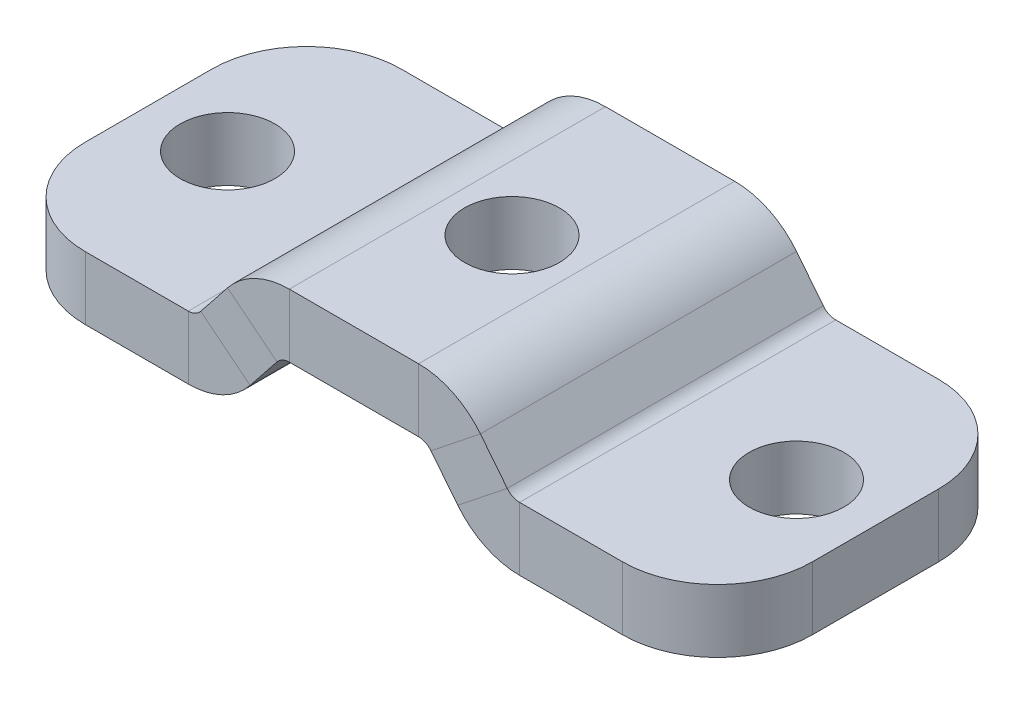
ISO-10303-21;
HEADER;
FILE_DESCRIPTION(('STEP AP214'),'2;1');
FILE_NAME('part.step','',(''),(''),'','','');
FILE_SCHEMA(('AUTOMOTIVE_DESIGN { 1 0 10303 214 1 1 1 1 }'));
ENDSEC;
DATA;
#1=APPLICATION_CONTEXT('core data for automotive mechanical design processes');
#2=APPLICATION_PROTOCOL_DEFINITION('international standard','automotive_design',2000,#1);
#3=PRODUCT_CONTEXT('',#1,'mechanical');
#4=PRODUCT('Part','Part','',(#3));
#5=PRODUCT_RELATED_PRODUCT_CATEGORY('part','',(#4));
#6=PRODUCT_DEFINITION_FORMATION('','',#4);
#7=PRODUCT_DEFINITION_CONTEXT('part definition',#1,'design');
#8=PRODUCT_DEFINITION('design','',#6,#7);
#9=PRODUCT_DEFINITION_SHAPE('','',#8);
#10=(LENGTH_UNIT() NAMED_UNIT(*) SI_UNIT(.MILLI.,.METRE.));
#11=(NAMED_UNIT(*) PLANE_ANGLE_UNIT() SI_UNIT($,.RADIAN.));
#12=(NAMED_UNIT(*) SI_UNIT($,.STERADIAN.) SOLID_ANGLE_UNIT());
#13=UNCERTAINTY_MEASURE_WITH_UNIT(LENGTH_MEASURE(1.E-05),#10,'distance_accuracy_value','');
#14=(GEOMETRIC_REPRESENTATION_CONTEXT(3) GLOBAL_UNCERTAINTY_ASSIGNED_CONTEXT((#13)) GLOBAL_UNIT_ASSIGNED_CONTEXT((#10,
#11,#12)) REPRESENTATION_CONTEXT('',''));
#15=CARTESIAN_POINT('',(0.,0.,0.));
#16=DIRECTION('',(0.,0.,1.));
#17=DIRECTION('',(1.,0.,0.));
#18=AXIS2_PLACEMENT_3D('',#15,#16,#17);
#19=CARTESIAN_POINT('',(5.,0.,-5.));
#20=DIRECTION('',(0.,0.,1.));
#21=DIRECTION('',(-0.622523565821539,0.782601054175648,0.));
#22=AXIS2_PLACEMENT_3D('',#19,#20,#21);
#23=PLANE('',#22);
#24=DIRECTION('',(0.782601054175649,0.622523565821539,0.));
#25=VECTOR('',#24,1.);
#26=CARTESIAN_POINT('',(4.84986732731539,0.18873821708923,-5.));
#27=LINE('',#26,#25);
#28=CARTESIAN_POINT('',(3.28466521896409,-1.05630891455385,-5.));
#29=VERTEX_POINT('',#28);
#30=CARTESIAN_POINT('',(4.84986732731539,0.18873821708923,-5.));
#31=VERTEX_POINT('',#30);
#32=EDGE_CURVE('E198',#29,#31,#27,.T.);
#33=ORIENTED_EDGE('',*,*,#32,.F.);
#34=DIRECTION('',(0.622523565821539,-0.782601054175649,0.));
#35=VECTOR('',#34,1.);
#36=CARTESIAN_POINT('',(3.4347978916487,-1.24504713164308,-5.));
#37=LINE('',#36,#35);
#38=CARTESIAN_POINT('',(2.43546125507178,0.0112617829107675,-5.));
#39=VERTEX_POINT('',#38);
#40=EDGE_CURVE('E320',#29,#39,#37,.F.);
#41=ORIENTED_EDGE('',*,*,#40,.T.);
#42=DIRECTION('',(0.782601054175649,0.622523565821539,0.));
#43=VECTOR('',#42,1.);
#44=CARTESIAN_POINT('',(4.00066336342308,1.25630891455384,-5.));
#45=LINE('',#44,#43);
#46=CARTESIAN_POINT('',(4.00066336342308,1.25630891455384,-5.));
#47=VERTEX_POINT('',#46);
#48=EDGE_CURVE('E211',#39,#47,#45,.T.);
#49=ORIENTED_EDGE('',*,*,#48,.T.);
#50=DIRECTION('',(-0.622523565821539,0.782601054175648,0.));
#51=VECTOR('',#50,1.);
#52=CARTESIAN_POINT('',(5.,0.,-5.));
#53=LINE('',#52,#51);
#54=EDGE_CURVE('E225',#31,#47,#53,.T.);
#55=ORIENTED_EDGE('',*,*,#54,.F.);
#56=EDGE_LOOP('',(#33,#41,#49,#55));
#57=FACE_BOUND('',#56,.T.);
#58=ADVANCED_FACE('F36',(#57),#23,.F.);
#59=CARTESIAN_POINT('',(2.04416072798396,-0.300000000000001,-5.));
#60=DIRECTION('',(0.,0.,1.));
#61=DIRECTION('',(1.,0.,0.));
#62=AXIS2_PLACEMENT_3D('',#59,#60,#61);
#63=PLANE('',#62);
#64=ORIENTED_EDGE('',*,*,#48,.F.);
#65=CARTESIAN_POINT('',(2.04416072798396,-0.300000000000001,-5.));
#66=DIRECTION('',(0.,0.,-1.));
#67=DIRECTION('',(-1.,0.,0.));
#68=AXIS2_PLACEMENT_3D('',#65,#66,#67);
#69=CIRCLE('',#68,0.5);
#70=CARTESIAN_POINT('',(2.04416072798396,0.199999999999999,-5.));
#71=VERTEX_POINT('',#70);
#72=EDGE_CURVE('E324',#39,#71,#69,.F.);
#73=ORIENTED_EDGE('',*,*,#72,.T.);
#74=DIRECTION('',(0.,1.,0.));
#75=VECTOR('',#74,1.);
#76=CARTESIAN_POINT('',(2.04416072798396,2.2,-5.));
#77=LINE('',#76,#75);
#78=CARTESIAN_POINT('',(2.04416072798396,2.2,-5.));
#79=VERTEX_POINT('',#78);
#80=EDGE_CURVE('E384',#71,#79,#77,.T.);
#81=ORIENTED_EDGE('',*,*,#80,.T.);
#82=CARTESIAN_POINT('',(2.04416072798396,-0.300000000000001,-5.));
#83=DIRECTION('',(0.,0.,-1.));
#84=DIRECTION('',(-1.,0.,0.));
#85=AXIS2_PLACEMENT_3D('',#82,#83,#84);
#86=CIRCLE('',#85,2.5);
#87=EDGE_CURVE('E252',#47,#79,#86,.F.);
#88=ORIENTED_EDGE('',*,*,#87,.F.);
#89=EDGE_LOOP('',(#64,#73,#81,#88));
#90=FACE_BOUND('',#89,.T.);
#91=ADVANCED_FACE('F482',(#90),#63,.F.);
#92=CARTESIAN_POINT('',(3.25,2.2,-5.));
#93=DIRECTION('',(0.,0.,1.));
#94=DIRECTION('',(-1.,0.,0.));
#95=AXIS2_PLACEMENT_3D('',#92,#93,#94);
#96=PLANE('',#95);
#97=ORIENTED_EDGE('',*,*,#80,.F.);
#98=DIRECTION('',(1.,0.,0.));
#99=VECTOR('',#98,1.);
#100=CARTESIAN_POINT('',(3.25,0.199999999999999,-5.));
#101=LINE('',#100,#99);
#102=CARTESIAN_POINT('',(-2.04416072798396,0.199999999999998,-5.));
#103=VERTEX_POINT('',#102);
#104=EDGE_CURVE('E328',#71,#103,#101,.F.);
#105=ORIENTED_EDGE('',*,*,#104,.T.);
#106=DIRECTION('',(0.,1.,0.));
#107=VECTOR('',#106,1.);
#108=CARTESIAN_POINT('',(-2.04416072798396,2.2,-5.));
#109=LINE('',#108,#107);
#110=CARTESIAN_POINT('',(-2.04416072798396,2.2,-5.));
#111=VERTEX_POINT('',#110);
#112=EDGE_CURVE('E382',#103,#111,#109,.T.);
#113=ORIENTED_EDGE('',*,*,#112,.T.);
#114=DIRECTION('',(-1.,0.,0.));
#115=VECTOR('',#114,1.);
#116=CARTESIAN_POINT('',(3.25,2.2,-5.));
#117=LINE('',#116,#115);
#118=EDGE_CURVE('E495',#79,#111,#117,.T.);
#119=ORIENTED_EDGE('',*,*,#118,.F.);
#120=EDGE_LOOP('',(#97,#105,#113,#119));
#121=FACE_BOUND('',#120,.T.);
#122=ADVANCED_FACE('F538',(#121),#96,.F.);
#123=CARTESIAN_POINT('',(-2.04416072798396,-0.300000000000002,-5.));
#124=DIRECTION('',(0.,0.,-1.));
#125=DIRECTION('',(-1.,0.,0.));
#126=AXIS2_PLACEMENT_3D('',#123,#124,#125);
#127=PLANE('',#126);
#128=ORIENTED_EDGE('',*,*,#112,.F.);
#129=CARTESIAN_POINT('',(-2.04416072798396,-0.300000000000002,-5.));
#130=DIRECTION('',(0.,0.,1.));
#131=DIRECTION('',(1.,0.,0.));
#132=AXIS2_PLACEMENT_3D('',#129,#130,#131);
#133=CIRCLE('',#132,0.5);
#134=CARTESIAN_POINT('',(-2.43546125507178,0.0112617829107673,-5.));
#135=VERTEX_POINT('',#134);
#136=EDGE_CURVE('E332',#103,#135,#133,.T.);
#137=ORIENTED_EDGE('',*,*,#136,.T.);
#138=DIRECTION('',(-0.782601054175649,0.622523565821539,0.));
#139=VECTOR('',#138,1.);
#140=CARTESIAN_POINT('',(-4.00066336342308,1.25630891455384,-5.));
#141=LINE('',#140,#139);
#142=CARTESIAN_POINT('',(-4.00066336342308,1.25630891455384,-5.));
#143=VERTEX_POINT('',#142);
#144=EDGE_CURVE('E380',#135,#143,#141,.T.);
#145=ORIENTED_EDGE('',*,*,#144,.T.);
#146=CARTESIAN_POINT('',(-2.04416072798396,-0.300000000000002,-5.));
#147=DIRECTION('',(0.,0.,1.));
#148=DIRECTION('',(1.,0.,0.));
#149=AXIS2_PLACEMENT_3D('',#146,#147,#148);
#150=CIRCLE('',#149,2.5);
#151=EDGE_CURVE('E264',#111,#143,#150,.T.);
#152=ORIENTED_EDGE('',*,*,#151,.F.);
#153=EDGE_LOOP('',(#128,#137,#145,#152));
#154=FACE_BOUND('',#153,.T.);
#155=ADVANCED_FACE('F586',(#154),#127,.T.);
#156=CARTESIAN_POINT('',(-5.,0.,-5.));
#157=DIRECTION('',(0.,0.,1.));
#158=DIRECTION('',(0.622523565821539,0.782601054175648,0.));
#159=AXIS2_PLACEMENT_3D('',#156,#157,#158);
#160=PLANE('',#159);
#161=ORIENTED_EDGE('',*,*,#144,.F.);
#162=DIRECTION('',(-0.622523565821539,-0.782601054175649,0.));
#163=VECTOR('',#162,1.);
#164=CARTESIAN_POINT('',(-3.4347978916487,-1.24504713164308,-5.));
#165=LINE('',#164,#163);
#166=CARTESIAN_POINT('',(-3.28466521896409,-1.05630891455385,-5.));
#167=VERTEX_POINT('',#166);
#168=EDGE_CURVE('E315',#167,#135,#165,.F.);
#169=ORIENTED_EDGE('',*,*,#168,.F.);
#170=DIRECTION('',(-0.782601054175649,0.622523565821539,0.));
#171=VECTOR('',#170,1.);
#172=CARTESIAN_POINT('',(-4.84986732731539,0.18873821708923,-5.));
#173=LINE('',#172,#171);
#174=CARTESIAN_POINT('',(-4.84986732731539,0.18873821708923,-5.));
#175=VERTEX_POINT('',#174);
#176=EDGE_CURVE('E378',#167,#175,#173,.T.);
#177=ORIENTED_EDGE('',*,*,#176,.T.);
#178=DIRECTION('',(0.622523565821539,0.782601054175648,0.));
#179=VECTOR('',#178,1.);
#180=CARTESIAN_POINT('',(-5.,0.,-5.));
#181=LINE('',#180,#179);
#182=EDGE_CURVE('E246',#175,#143,#181,.T.);
#183=ORIENTED_EDGE('',*,*,#182,.T.);
#184=EDGE_LOOP('',(#161,#169,#177,#183));
#185=FACE_BOUND('',#184,.T.);
#186=ADVANCED_FACE('F578',(#185),#160,.F.);
#187=CARTESIAN_POINT('',(-5.24116785440321,0.499999999999999,-5.));
#188=DIRECTION('',(0.,0.,-1.));
#189=DIRECTION('',(-1.,0.,0.));
#190=AXIS2_PLACEMENT_3D('',#187,#188,#189);
#191=PLANE('',#190);
#192=ORIENTED_EDGE('',*,*,#176,.F.);
#193=CARTESIAN_POINT('',(-5.24116785440321,0.499999999999999,-5.));
#194=DIRECTION('',(0.,0.,1.));
#195=DIRECTION('',(1.,0.,0.));
#196=AXIS2_PLACEMENT_3D('',#193,#194,#195);
#197=CIRCLE('',#196,2.5);
#198=CARTESIAN_POINT('',(-5.24116785440322,-2.,-5.));
#199=VERTEX_POINT('',#198);
#200=EDGE_CURVE('E339',#167,#199,#197,.F.);
#201=ORIENTED_EDGE('',*,*,#200,.T.);
#202=DIRECTION('',(0.,1.,0.));
#203=VECTOR('',#202,1.);
#204=CARTESIAN_POINT('',(-5.24116785440321,0.,-5.));
#205=LINE('',#204,#203);
#206=CARTESIAN_POINT('',(-5.24116785440321,0.,-5.));
#207=VERTEX_POINT('',#206);
#208=EDGE_CURVE('E375',#199,#207,#205,.T.);
#209=ORIENTED_EDGE('',*,*,#208,.T.);
#210=CARTESIAN_POINT('',(-5.24116785440321,0.499999999999999,-5.));
#211=DIRECTION('',(0.,0.,1.));
#212=DIRECTION('',(1.,0.,0.));
#213=AXIS2_PLACEMENT_3D('',#210,#211,#212);
#214=CIRCLE('',#213,0.5);
#215=EDGE_CURVE('E276',#175,#207,#214,.F.);
#216=ORIENTED_EDGE('',*,*,#215,.F.);
#217=EDGE_LOOP('',(#192,#201,#209,#216));
#218=FACE_BOUND('',#217,.T.);
#219=ADVANCED_FACE('F570',(#218),#191,.T.);
#220=CARTESIAN_POINT('',(-11.5,0.,-5.));
#221=DIRECTION('',(0.,0.,1.));
#222=DIRECTION('',(1.,0.,0.));
#223=AXIS2_PLACEMENT_3D('',#220,#221,#222);
#224=PLANE('',#223);
#225=DIRECTION('',(-1.,0.,0.));
#226=VECTOR('',#225,1.);
#227=CARTESIAN_POINT('',(-11.5,-2.,-5.));
#228=LINE('',#227,#226);
#229=CARTESIAN_POINT('',(-8.5,-2.,-5.));
#230=VERTEX_POINT('',#229);
#231=EDGE_CURVE('E319',#230,#199,#228,.F.);
#232=ORIENTED_EDGE('',*,*,#231,.F.);
#233=DIRECTION('',(0.,-1.,0.));
#234=VECTOR('',#233,1.);
#235=CARTESIAN_POINT('',(-8.5,0.,-5.));
#236=LINE('',#235,#234);
#237=CARTESIAN_POINT('',(-8.5,0.,-5.));
#238=VERTEX_POINT('',#237);
#239=EDGE_CURVE('E409',#230,#238,#236,.F.);
#240=ORIENTED_EDGE('',*,*,#239,.T.);
#241=DIRECTION('',(1.,0.,0.));
#242=VECTOR('',#241,1.);
#243=CARTESIAN_POINT('',(-11.5,0.,-5.));
#244=LINE('',#243,#242);
#245=EDGE_CURVE('E437',#238,#207,#244,.T.);
#246=ORIENTED_EDGE('',*,*,#245,.T.);
#247=ORIENTED_EDGE('',*,*,#208,.F.);
#248=EDGE_LOOP('',(#232,#240,#246,#247));
#249=FACE_BOUND('',#248,.T.);
#250=ADVANCED_FACE('F430',(#249),#224,.F.);
#251=CARTESIAN_POINT('',(-11.5,0.,5.));
#252=DIRECTION('',(1.,0.,0.));
#253=DIRECTION('',(0.,0.,-1.));
#254=AXIS2_PLACEMENT_3D('',#251,#252,#253);
#255=PLANE('',#254);
#256=DIRECTION('',(0.,0.,-1.));
#257=VECTOR('',#256,1.);
#258=CARTESIAN_POINT('',(-11.5,0.,5.));
#259=LINE('',#258,#257);
#260=CARTESIAN_POINT('',(-11.5,0.,2.));
#261=VERTEX_POINT('',#260);
#262=CARTESIAN_POINT('',(-11.5,0.,-2.));
#263=VERTEX_POINT('',#262);
#264=EDGE_CURVE('E436',#261,#263,#259,.T.);
#265=ORIENTED_EDGE('',*,*,#264,.T.);
#266=DIRECTION('',(0.,-1.,0.));
#267=VECTOR('',#266,1.);
#268=CARTESIAN_POINT('',(-11.5,0.,-2.));
#269=LINE('',#268,#267);
#270=CARTESIAN_POINT('',(-11.5,-2.,-2.));
#271=VERTEX_POINT('',#270);
#272=EDGE_CURVE('E57',#263,#271,#269,.T.);
#273=ORIENTED_EDGE('',*,*,#272,.T.);
#274=DIRECTION('',(0.,0.,1.));
#275=VECTOR('',#274,1.);
#276=CARTESIAN_POINT('',(-11.5,-2.,5.));
#277=LINE('',#276,#275);
#278=CARTESIAN_POINT('',(-11.5,-2.,2.));
#279=VERTEX_POINT('',#278);
#280=EDGE_CURVE('E341',#279,#271,#277,.F.);
#281=ORIENTED_EDGE('',*,*,#280,.F.);
#282=DIRECTION('',(0.,1.,0.));
#283=VECTOR('',#282,1.);
#284=CARTESIAN_POINT('',(-11.5,0.,2.));
#285=LINE('',#284,#283);
#286=EDGE_CURVE('E416',#279,#261,#285,.T.);
#287=ORIENTED_EDGE('',*,*,#286,.T.);
#288=EDGE_LOOP('',(#265,#273,#281,#287));
#289=FACE_BOUND('',#288,.T.);
#290=ADVANCED_FACE('F438',(#289),#255,.F.);
#291=CARTESIAN_POINT('',(-11.5,0.,5.));
#292=DIRECTION('',(0.,0.,1.));
#293=DIRECTION('',(1.,0.,0.));
#294=AXIS2_PLACEMENT_3D('',#291,#292,#293);
#295=PLANE('',#294);
#296=DIRECTION('',(1.,0.,0.));
#297=VECTOR('',#296,1.);
#298=CARTESIAN_POINT('',(-11.5,0.,5.));
#299=LINE('',#298,#297);
#300=CARTESIAN_POINT('',(-8.5,0.,5.));
#301=VERTEX_POINT('',#300);
#302=CARTESIAN_POINT('',(-5.24116785440321,0.,5.));
#303=VERTEX_POINT('',#302);
#304=EDGE_CURVE('E440',#301,#303,#299,.T.);
#305=ORIENTED_EDGE('',*,*,#304,.F.);
#306=DIRECTION('',(0.,-1.,0.));
#307=VECTOR('',#306,1.);
#308=CARTESIAN_POINT('',(-8.5,0.,5.));
#309=LINE('',#308,#307);
#310=CARTESIAN_POINT('',(-8.5,-2.,5.));
#311=VERTEX_POINT('',#310);
#312=EDGE_CURVE('E11',#301,#311,#309,.T.);
#313=ORIENTED_EDGE('',*,*,#312,.T.);
#314=DIRECTION('',(-1.,0.,0.));
#315=VECTOR('',#314,1.);
#316=CARTESIAN_POINT('',(-11.5,-2.,5.));
#317=LINE('',#316,#315);
#318=CARTESIAN_POINT('',(-5.24116785440321,-2.,5.));
#319=VERTEX_POINT('',#318);
#320=EDGE_CURVE('E308',#311,#319,#317,.F.);
#321=ORIENTED_EDGE('',*,*,#320,.T.);
#322=DIRECTION('',(0.,1.,0.));
#323=VECTOR('',#322,1.);
#324=CARTESIAN_POINT('',(-5.24116785440321,0.,5.));
#325=LINE('',#324,#323);
#326=EDGE_CURVE('E372',#319,#303,#325,.T.);
#327=ORIENTED_EDGE('',*,*,#326,.T.);
#328=EDGE_LOOP('',(#305,#313,#321,#327));
#329=FACE_BOUND('',#328,.T.);
#330=ADVANCED_FACE('F561',(#329),#295,.T.);
#331=CARTESIAN_POINT('',(-5.24116785440321,0.499999999999999,5.));
#332=DIRECTION('',(0.,0.,1.));
#333=DIRECTION('',(1.,0.,0.));
#334=AXIS2_PLACEMENT_3D('',#331,#332,#333);
#335=PLANE('',#334);
#336=ORIENTED_EDGE('',*,*,#326,.F.);
#337=CARTESIAN_POINT('',(-5.24116785440321,0.499999999999999,5.));
#338=DIRECTION('',(0.,0.,1.));
#339=DIRECTION('',(1.,0.,0.));
#340=AXIS2_PLACEMENT_3D('',#337,#338,#339);
#341=CIRCLE('',#340,2.5);
#342=CARTESIAN_POINT('',(-3.28466521896409,-1.05630891455385,5.));
#343=VERTEX_POINT('',#342);
#344=EDGE_CURVE('E336',#319,#343,#341,.T.);
#345=ORIENTED_EDGE('',*,*,#344,.T.);
#346=DIRECTION('',(-0.782601054175649,0.622523565821539,0.));
#347=VECTOR('',#346,1.);
#348=CARTESIAN_POINT('',(-4.84986732731539,0.18873821708923,5.));
#349=LINE('',#348,#347);
#350=CARTESIAN_POINT('',(-4.84986732731539,0.18873821708923,5.));
#351=VERTEX_POINT('',#350);
#352=EDGE_CURVE('E370',#343,#351,#349,.T.);
#353=ORIENTED_EDGE('',*,*,#352,.T.);
#354=CARTESIAN_POINT('',(-5.24116785440321,0.499999999999999,5.));
#355=DIRECTION('',(0.,0.,-1.));
#356=DIRECTION('',(-1.,0.,0.));
#357=AXIS2_PLACEMENT_3D('',#354,#355,#356);
#358=CIRCLE('',#357,0.5);
#359=EDGE_CURVE('E267',#303,#351,#358,.F.);
#360=ORIENTED_EDGE('',*,*,#359,.F.);
#361=EDGE_LOOP('',(#336,#345,#353,#360));
#362=FACE_BOUND('',#361,.T.);
#363=ADVANCED_FACE('F564',(#362),#335,.T.);
#364=CARTESIAN_POINT('',(-5.,0.,5.));
#365=DIRECTION('',(0.,0.,1.));
#366=DIRECTION('',(0.622523565821539,0.782601054175648,0.));
#367=AXIS2_PLACEMENT_3D('',#364,#365,#366);
#368=PLANE('',#367);
#369=ORIENTED_EDGE('',*,*,#352,.F.);
#370=DIRECTION('',(-0.622523565821539,-0.782601054175649,0.));
#371=VECTOR('',#370,1.);
#372=CARTESIAN_POINT('',(-3.4347978916487,-1.24504713164308,5.));
#373=LINE('',#372,#371);
#374=CARTESIAN_POINT('',(-2.43546125507178,0.0112617829107666,5.));
#375=VERTEX_POINT('',#374);
#376=EDGE_CURVE('E333',#343,#375,#373,.F.);
#377=ORIENTED_EDGE('',*,*,#376,.T.);
#378=DIRECTION('',(-0.782601054175649,0.622523565821538,0.));
#379=VECTOR('',#378,1.);
#380=CARTESIAN_POINT('',(-4.00066336342308,1.25630891455384,5.));
#381=LINE('',#380,#379);
#382=CARTESIAN_POINT('',(-4.00066336342308,1.25630891455384,5.));
#383=VERTEX_POINT('',#382);
#384=EDGE_CURVE('E368',#375,#383,#381,.T.);
#385=ORIENTED_EDGE('',*,*,#384,.T.);
#386=DIRECTION('',(0.622523565821539,0.782601054175648,0.));
#387=VECTOR('',#386,1.);
#388=CARTESIAN_POINT('',(-5.,0.,5.));
#389=LINE('',#388,#387);
#390=EDGE_CURVE('E498',#351,#383,#389,.T.);
#391=ORIENTED_EDGE('',*,*,#390,.F.);
#392=EDGE_LOOP('',(#369,#377,#385,#391));
#393=FACE_BOUND('',#392,.T.);
#394=ADVANCED_FACE('F600',(#393),#368,.T.);
#395=CARTESIAN_POINT('',(-2.04416072798396,-0.300000000000002,5.));
#396=DIRECTION('',(0.,0.,1.));
#397=DIRECTION('',(1.,0.,0.));
#398=AXIS2_PLACEMENT_3D('',#395,#396,#397);
#399=PLANE('',#398);
#400=ORIENTED_EDGE('',*,*,#384,.F.);
#401=CARTESIAN_POINT('',(-2.04416072798396,-0.300000000000002,5.));
#402=DIRECTION('',(0.,0.,1.));
#403=DIRECTION('',(1.,0.,0.));
#404=AXIS2_PLACEMENT_3D('',#401,#402,#403);
#405=CIRCLE('',#404,0.5);
#406=CARTESIAN_POINT('',(-2.04416072798396,0.199999999999998,5.));
#407=VERTEX_POINT('',#406);
#408=EDGE_CURVE('E329',#375,#407,#405,.F.);
#409=ORIENTED_EDGE('',*,*,#408,.T.);
#410=DIRECTION('',(0.,1.,0.));
#411=VECTOR('',#410,1.);
#412=CARTESIAN_POINT('',(-2.04416072798396,2.2,5.));
#413=LINE('',#412,#411);
#414=CARTESIAN_POINT('',(-2.04416072798396,2.2,5.));
#415=VERTEX_POINT('',#414);
#416=EDGE_CURVE('E366',#407,#415,#413,.T.);
#417=ORIENTED_EDGE('',*,*,#416,.T.);
#418=CARTESIAN_POINT('',(-2.04416072798396,-0.300000000000002,5.));
#419=DIRECTION('',(0.,0.,-1.));
#420=DIRECTION('',(-1.,0.,0.));
#421=AXIS2_PLACEMENT_3D('',#418,#419,#420);
#422=CIRCLE('',#421,2.5);
#423=EDGE_CURVE('E255',#383,#415,#422,.T.);
#424=ORIENTED_EDGE('',*,*,#423,.F.);
#425=EDGE_LOOP('',(#400,#409,#417,#424));
#426=FACE_BOUND('',#425,.T.);
#427=ADVANCED_FACE('F597',(#426),#399,.T.);
#428=CARTESIAN_POINT('',(3.25,2.2,5.));
#429=DIRECTION('',(0.,0.,1.));
#430=DIRECTION('',(-1.,0.,0.));
#431=AXIS2_PLACEMENT_3D('',#428,#429,#430);
#432=PLANE('',#431);
#433=ORIENTED_EDGE('',*,*,#416,.F.);
#434=DIRECTION('',(1.,0.,0.));
#435=VECTOR('',#434,1.);
#436=CARTESIAN_POINT('',(3.25,0.199999999999999,5.));
#437=LINE('',#436,#435);
#438=CARTESIAN_POINT('',(2.04416072798396,0.199999999999999,5.));
#439=VERTEX_POINT('',#438);
#440=EDGE_CURVE('E325',#439,#407,#437,.F.);
#441=ORIENTED_EDGE('',*,*,#440,.F.);
#442=DIRECTION('',(0.,1.,0.));
#443=VECTOR('',#442,1.);
#444=CARTESIAN_POINT('',(2.04416072798396,2.2,5.));
#445=LINE('',#444,#443);
#446=CARTESIAN_POINT('',(2.04416072798396,2.2,5.));
#447=VERTEX_POINT('',#446);
#448=EDGE_CURVE('E364',#439,#447,#445,.T.);
#449=ORIENTED_EDGE('',*,*,#448,.T.);
#450=DIRECTION('',(-1.,0.,0.));
#451=VECTOR('',#450,1.);
#452=CARTESIAN_POINT('',(3.25,2.2,5.));
#453=LINE('',#452,#451);
#454=EDGE_CURVE('E230',#447,#415,#453,.T.);
#455=ORIENTED_EDGE('',*,*,#454,.T.);
#456=EDGE_LOOP('',(#433,#441,#449,#455));
#457=FACE_BOUND('',#456,.T.);
#458=ADVANCED_FACE('F609',(#457),#432,.T.);
#459=CARTESIAN_POINT('',(2.04416072798396,-0.300000000000001,5.));
#460=DIRECTION('',(0.,0.,-1.));
#461=DIRECTION('',(-1.,0.,0.));
#462=AXIS2_PLACEMENT_3D('',#459,#460,#461);
#463=PLANE('',#462);
#464=ORIENTED_EDGE('',*,*,#448,.F.);
#465=CARTESIAN_POINT('',(2.04416072798396,-0.300000000000001,5.));
#466=DIRECTION('',(0.,0.,-1.));
#467=DIRECTION('',(-1.,0.,0.));
#468=AXIS2_PLACEMENT_3D('',#465,#466,#467);
#469=CIRCLE('',#468,0.5);
#470=CARTESIAN_POINT('',(2.43546125507178,0.0112617829107678,5.));
#471=VERTEX_POINT('',#470);
#472=EDGE_CURVE('E321',#439,#471,#469,.T.);
#473=ORIENTED_EDGE('',*,*,#472,.T.);
#474=DIRECTION('',(0.782601054175649,0.622523565821539,0.));
#475=VECTOR('',#474,1.);
#476=CARTESIAN_POINT('',(4.00066336342308,1.25630891455384,5.));
#477=LINE('',#476,#475);
#478=CARTESIAN_POINT('',(4.00066336342308,1.25630891455384,5.));
#479=VERTEX_POINT('',#478);
#480=EDGE_CURVE('E362',#471,#479,#477,.T.);
#481=ORIENTED_EDGE('',*,*,#480,.T.);
#482=CARTESIAN_POINT('',(2.04416072798396,-0.300000000000001,5.));
#483=DIRECTION('',(0.,0.,1.));
#484=DIRECTION('',(1.,0.,0.));
#485=AXIS2_PLACEMENT_3D('',#482,#483,#484);
#486=CIRCLE('',#485,2.5);
#487=EDGE_CURVE('E222',#447,#479,#486,.F.);
#488=ORIENTED_EDGE('',*,*,#487,.F.);
#489=EDGE_LOOP('',(#464,#473,#481,#488));
#490=FACE_BOUND('',#489,.T.);
#491=ADVANCED_FACE('F610',(#490),#463,.F.);
#492=CARTESIAN_POINT('',(5.,0.,5.));
#493=DIRECTION('',(0.,0.,1.));
#494=DIRECTION('',(-0.622523565821539,0.782601054175648,0.));
#495=AXIS2_PLACEMENT_3D('',#492,#493,#494);
#496=PLANE('',#495);
#497=ORIENTED_EDGE('',*,*,#480,.F.);
#498=DIRECTION('',(0.622523565821539,-0.782601054175649,0.));
#499=VECTOR('',#498,1.);
#500=CARTESIAN_POINT('',(3.4347978916487,-1.24504713164308,5.));
#501=LINE('',#500,#499);
#502=CARTESIAN_POINT('',(3.28466521896409,-1.05630891455385,5.));
#503=VERTEX_POINT('',#502);
#504=EDGE_CURVE('E316',#503,#471,#501,.F.);
#505=ORIENTED_EDGE('',*,*,#504,.F.);
#506=DIRECTION('',(0.782601054175649,0.622523565821539,0.));
#507=VECTOR('',#506,1.);
#508=CARTESIAN_POINT('',(4.84986732731539,0.18873821708923,5.));
#509=LINE('',#508,#507);
#510=CARTESIAN_POINT('',(4.84986732731539,0.18873821708923,5.));
#511=VERTEX_POINT('',#510);
#512=EDGE_CURVE('E360',#503,#511,#509,.T.);
#513=ORIENTED_EDGE('',*,*,#512,.T.);
#514=DIRECTION('',(-0.622523565821539,0.782601054175648,0.));
#515=VECTOR('',#514,1.);
#516=CARTESIAN_POINT('',(5.,0.,5.));
#517=LINE('',#516,#515);
#518=EDGE_CURVE('E229',#511,#479,#517,.T.);
#519=ORIENTED_EDGE('',*,*,#518,.T.);
#520=EDGE_LOOP('',(#497,#505,#513,#519));
#521=FACE_BOUND('',#520,.T.);
#522=ADVANCED_FACE('F491',(#521),#496,.T.);
#523=CARTESIAN_POINT('',(5.24116785440321,0.499999999999999,5.));
#524=DIRECTION('',(0.,0.,1.));
#525=DIRECTION('',(1.,0.,0.));
#526=AXIS2_PLACEMENT_3D('',#523,#524,#525);
#527=PLANE('',#526);
#528=ORIENTED_EDGE('',*,*,#512,.F.);
#529=CARTESIAN_POINT('',(5.24116785440321,0.499999999999999,5.));
#530=DIRECTION('',(0.,0.,1.));
#531=DIRECTION('',(1.,0.,0.));
#532=AXIS2_PLACEMENT_3D('',#529,#530,#531);
#533=CIRCLE('',#532,2.5);
#534=CARTESIAN_POINT('',(5.24116785440322,-2.,5.));
#535=VERTEX_POINT('',#534);
#536=EDGE_CURVE('E312',#503,#535,#533,.T.);
#537=ORIENTED_EDGE('',*,*,#536,.T.);
#538=DIRECTION('',(0.,1.,0.));
#539=VECTOR('',#538,1.);
#540=CARTESIAN_POINT('',(5.24116785440321,0.,5.));
#541=LINE('',#540,#539);
#542=CARTESIAN_POINT('',(5.24116785440321,0.,5.));
#543=VERTEX_POINT('',#542);
#544=EDGE_CURVE('E357',#535,#543,#541,.T.);
#545=ORIENTED_EDGE('',*,*,#544,.T.);
#546=CARTESIAN_POINT('',(5.24116785440321,0.499999999999999,5.));
#547=DIRECTION('',(0.,0.,-1.));
#548=DIRECTION('',(-1.,0.,0.));
#549=AXIS2_PLACEMENT_3D('',#546,#547,#548);
#550=CIRCLE('',#549,0.5);
#551=EDGE_CURVE('E221',#511,#543,#550,.F.);
#552=ORIENTED_EDGE('',*,*,#551,.F.);
#553=EDGE_LOOP('',(#528,#537,#545,#552));
#554=FACE_BOUND('',#553,.T.);
#555=ADVANCED_FACE('F455',(#554),#527,.T.);
#556=CARTESIAN_POINT('',(11.5,0.,5.));
#557=DIRECTION('',(0.,0.,1.));
#558=DIRECTION('',(-1.,0.,0.));
#559=AXIS2_PLACEMENT_3D('',#556,#557,#558);
#560=PLANE('',#559);
#561=DIRECTION('',(1.,0.,0.));
#562=VECTOR('',#561,1.);
#563=CARTESIAN_POINT('',(11.5,-2.,5.));
#564=LINE('',#563,#562);
#565=CARTESIAN_POINT('',(8.5,-2.,5.));
#566=VERTEX_POINT('',#565);
#567=EDGE_CURVE('E307',#566,#535,#564,.F.);
#568=ORIENTED_EDGE('',*,*,#567,.F.);
#569=DIRECTION('',(0.,-1.,0.));
#570=VECTOR('',#569,1.);
#571=CARTESIAN_POINT('',(8.5,0.,5.));
#572=LINE('',#571,#570);
#573=CARTESIAN_POINT('',(8.5,0.,5.));
#574=VERTEX_POINT('',#573);
#575=EDGE_CURVE('E406',#566,#574,#572,.F.);
#576=ORIENTED_EDGE('',*,*,#575,.T.);
#577=DIRECTION('',(-1.,0.,0.));
#578=VECTOR('',#577,1.);
#579=CARTESIAN_POINT('',(11.5,0.,5.));
#580=LINE('',#579,#578);
#581=EDGE_CURVE('E241',#574,#543,#580,.T.);
#582=ORIENTED_EDGE('',*,*,#581,.T.);
#583=ORIENTED_EDGE('',*,*,#544,.F.);
#584=EDGE_LOOP('',(#568,#576,#582,#583));
#585=FACE_BOUND('',#584,.T.);
#586=ADVANCED_FACE('F451',(#585),#560,.T.);
#587=CARTESIAN_POINT('',(11.5,0.,5.));
#588=DIRECTION('',(-1.,0.,0.));
#589=DIRECTION('',(0.,0.,-1.));
#590=AXIS2_PLACEMENT_3D('',#587,#588,#589);
#591=PLANE('',#590);
#592=DIRECTION('',(0.,0.,1.));
#593=VECTOR('',#592,1.);
#594=CARTESIAN_POINT('',(11.5,-2.,5.));
#595=LINE('',#594,#593);
#596=CARTESIAN_POINT('',(11.5,-2.,2.));
#597=VERTEX_POINT('',#596);
#598=CARTESIAN_POINT('',(11.5,-2.,-2.));
#599=VERTEX_POINT('',#598);
#600=EDGE_CURVE('E288',#597,#599,#595,.F.);
#601=ORIENTED_EDGE('',*,*,#600,.T.);
#602=DIRECTION('',(0.,-1.,0.));
#603=VECTOR('',#602,1.);
#604=CARTESIAN_POINT('',(11.5,0.,-2.));
#605=LINE('',#604,#603);
#606=CARTESIAN_POINT('',(11.5,0.,-2.));
#607=VERTEX_POINT('',#606);
#608=EDGE_CURVE('E393',#599,#607,#605,.F.);
#609=ORIENTED_EDGE('',*,*,#608,.T.);
#610=DIRECTION('',(0.,0.,-1.));
#611=VECTOR('',#610,1.);
#612=CARTESIAN_POINT('',(11.5,0.,5.));
#613=LINE('',#612,#611);
#614=CARTESIAN_POINT('',(11.5,0.,2.));
#615=VERTEX_POINT('',#614);
#616=EDGE_CURVE('E236',#615,#607,#613,.T.);
#617=ORIENTED_EDGE('',*,*,#616,.F.);
#618=DIRECTION('',(0.,1.,0.));
#619=VECTOR('',#618,1.);
#620=CARTESIAN_POINT('',(11.5,0.,2.));
#621=LINE('',#620,#619);
#622=EDGE_CURVE('E210',#615,#597,#621,.F.);
#623=ORIENTED_EDGE('',*,*,#622,.T.);
#624=EDGE_LOOP('',(#601,#609,#617,#623));
#625=FACE_BOUND('',#624,.T.);
#626=ADVANCED_FACE('F929',(#625),#591,.F.);
#627=CARTESIAN_POINT('',(11.5,0.,-5.));
#628=DIRECTION('',(0.,0.,1.));
#629=DIRECTION('',(-1.,0.,0.));
#630=AXIS2_PLACEMENT_3D('',#627,#628,#629);
#631=PLANE('',#630);
#632=DIRECTION('',(-1.,0.,0.));
#633=VECTOR('',#632,1.);
#634=CARTESIAN_POINT('',(11.5,0.,-5.));
#635=LINE('',#634,#633);
#636=CARTESIAN_POINT('',(8.5,0.,-5.));
#637=VERTEX_POINT('',#636);
#638=CARTESIAN_POINT('',(5.24116785440321,0.,-5.));
#639=VERTEX_POINT('',#638);
#640=EDGE_CURVE('E442',#637,#639,#635,.T.);
#641=ORIENTED_EDGE('',*,*,#640,.F.);
#642=DIRECTION('',(0.,-1.,0.));
#643=VECTOR('',#642,1.);
#644=CARTESIAN_POINT('',(8.5,0.,-5.));
#645=LINE('',#644,#643);
#646=CARTESIAN_POINT('',(8.5,-2.,-5.));
#647=VERTEX_POINT('',#646);
#648=EDGE_CURVE('E400',#637,#647,#645,.T.);
#649=ORIENTED_EDGE('',*,*,#648,.T.);
#650=DIRECTION('',(1.,0.,0.));
#651=VECTOR('',#650,1.);
#652=CARTESIAN_POINT('',(11.5,-2.,-5.));
#653=LINE('',#652,#651);
#654=CARTESIAN_POINT('',(5.24116785440321,-2.,-5.));
#655=VERTEX_POINT('',#654);
#656=EDGE_CURVE('E305',#647,#655,#653,.F.);
#657=ORIENTED_EDGE('',*,*,#656,.T.);
#658=DIRECTION('',(0.,1.,0.));
#659=VECTOR('',#658,1.);
#660=CARTESIAN_POINT('',(5.24116785440321,0.,-5.));
#661=LINE('',#660,#659);
#662=EDGE_CURVE('E275',#655,#639,#661,.T.);
#663=ORIENTED_EDGE('',*,*,#662,.T.);
#664=EDGE_LOOP('',(#641,#649,#657,#663));
#665=FACE_BOUND('',#664,.T.);
#666=ADVANCED_FACE('F461',(#665),#631,.F.);
#667=CARTESIAN_POINT('',(5.24116785440321,0.499999999999999,-5.));
#668=DIRECTION('',(0.,0.,-1.));
#669=DIRECTION('',(-1.,0.,0.));
#670=AXIS2_PLACEMENT_3D('',#667,#668,#669);
#671=PLANE('',#670);
#672=CARTESIAN_POINT('',(5.24116785440321,0.499999999999999,-5.));
#673=DIRECTION('',(0.,0.,1.));
#674=DIRECTION('',(1.,0.,0.));
#675=AXIS2_PLACEMENT_3D('',#672,#673,#674);
#676=CIRCLE('',#675,2.5);
#677=EDGE_CURVE('E205',#655,#29,#676,.F.);
#678=ORIENTED_EDGE('',*,*,#677,.T.);
#679=ORIENTED_EDGE('',*,*,#32,.T.);
#680=CARTESIAN_POINT('',(5.24116785440321,0.499999999999999,-5.));
#681=DIRECTION('',(0.,0.,1.));
#682=DIRECTION('',(1.,0.,0.));
#683=AXIS2_PLACEMENT_3D('',#680,#681,#682);
#684=CIRCLE('',#683,0.5);
#685=EDGE_CURVE('E202',#639,#31,#684,.F.);
#686=ORIENTED_EDGE('',*,*,#685,.F.);
#687=ORIENTED_EDGE('',*,*,#662,.F.);
#688=EDGE_LOOP('',(#678,#679,#686,#687));
#689=FACE_BOUND('',#688,.T.);
#690=ADVANCED_FACE('F200',(#689),#671,.T.);
#691=CARTESIAN_POINT('',(11.5,0.,5.));
#692=DIRECTION('',(0.,-1.,0.));
#693=DIRECTION('',(1.,0.,0.));
#694=AXIS2_PLACEMENT_3D('',#691,#692,#693);
#695=PLANE('',#694);
#696=CARTESIAN_POINT('',(9.,0.,0.));
#697=DIRECTION('',(0.,-1.,0.));
#698=DIRECTION('',(1.,0.,0.));
#699=AXIS2_PLACEMENT_3D('',#696,#697,#698);
#700=CIRCLE('',#699,1.5);
#701=CARTESIAN_POINT('',(10.5,0.,0.));
#702=VERTEX_POINT('',#701);
#703=EDGE_CURVE('E512',#702,#702,#700,.T.);
#704=ORIENTED_EDGE('',*,*,#703,.T.);
#705=EDGE_LOOP('',(#704));
#706=FACE_BOUND('',#705,.T.);
#707=ORIENTED_EDGE('',*,*,#616,.T.);
#708=CARTESIAN_POINT('',(8.5,0.,-2.));
#709=DIRECTION('',(0.,-1.,0.));
#710=DIRECTION('',(1.,0.,0.));
#711=AXIS2_PLACEMENT_3D('',#708,#709,#710);
#712=CIRCLE('',#711,3.);
#713=EDGE_CURVE('E398',#607,#637,#712,.F.);
#714=ORIENTED_EDGE('',*,*,#713,.T.);
#715=ORIENTED_EDGE('',*,*,#640,.T.);
#716=DIRECTION('',(0.,0.,-1.));
#717=VECTOR('',#716,1.);
#718=CARTESIAN_POINT('',(5.24116785440321,0.,5.));
#719=LINE('',#718,#717);
#720=EDGE_CURVE('E220',#639,#543,#719,.F.);
#721=ORIENTED_EDGE('',*,*,#720,.T.);
#722=ORIENTED_EDGE('',*,*,#581,.F.);
#723=CARTESIAN_POINT('',(8.5,0.,2.));
#724=DIRECTION('',(0.,-1.,0.));
#725=DIRECTION('',(1.,0.,0.));
#726=AXIS2_PLACEMENT_3D('',#723,#724,#725);
#727=CIRCLE('',#726,3.);
#728=EDGE_CURVE('E396',#574,#615,#727,.F.);
#729=ORIENTED_EDGE('',*,*,#728,.T.);
#730=EDGE_LOOP('',(#707,#714,#715,#721,#722,#729));
#731=FACE_BOUND('',#730,.T.);
#732=ADVANCED_FACE('F457',(#706,#731),#695,.F.);
#733=CARTESIAN_POINT('',(-11.5,0.,5.));
#734=DIRECTION('',(0.,1.,0.));
#735=DIRECTION('',(-1.,0.,0.));
#736=AXIS2_PLACEMENT_3D('',#733,#734,#735);
#737=PLANE('',#736);
#738=CARTESIAN_POINT('',(-9.,0.,0.));
#739=DIRECTION('',(0.,1.,0.));
#740=DIRECTION('',(-1.,0.,0.));
#741=AXIS2_PLACEMENT_3D('',#738,#739,#740);
#742=CIRCLE('',#741,1.5);
#743=CARTESIAN_POINT('',(-10.5,0.,0.));
#744=VERTEX_POINT('',#743);
#745=EDGE_CURVE('E506',#744,#744,#742,.T.);
#746=ORIENTED_EDGE('',*,*,#745,.F.);
#747=EDGE_LOOP('',(#746));
#748=FACE_BOUND('',#747,.T.);
#749=ORIENTED_EDGE('',*,*,#245,.F.);
#750=CARTESIAN_POINT('',(-8.5,0.,-2.));
#751=DIRECTION('',(0.,1.,0.));
#752=DIRECTION('',(-1.,0.,0.));
#753=AXIS2_PLACEMENT_3D('',#750,#751,#752);
#754=CIRCLE('',#753,3.);
#755=EDGE_CURVE('E414',#238,#263,#754,.T.);
#756=ORIENTED_EDGE('',*,*,#755,.T.);
#757=ORIENTED_EDGE('',*,*,#264,.F.);
#758=CARTESIAN_POINT('',(-8.5,0.,2.));
#759=DIRECTION('',(0.,1.,0.));
#760=DIRECTION('',(-1.,0.,0.));
#761=AXIS2_PLACEMENT_3D('',#758,#759,#760);
#762=CIRCLE('',#761,3.);
#763=EDGE_CURVE('E412',#261,#301,#762,.T.);
#764=ORIENTED_EDGE('',*,*,#763,.T.);
#765=ORIENTED_EDGE('',*,*,#304,.T.);
#766=DIRECTION('',(0.,0.,-1.));
#767=VECTOR('',#766,1.);
#768=CARTESIAN_POINT('',(-5.24116785440321,0.,-5.));
#769=LINE('',#768,#767);
#770=EDGE_CURVE('E263',#303,#207,#769,.T.);
#771=ORIENTED_EDGE('',*,*,#770,.T.);
#772=EDGE_LOOP('',(#749,#756,#757,#764,#765,#771));
#773=FACE_BOUND('',#772,.T.);
#774=ADVANCED_FACE('F435',(#748,#773),#737,.T.);
#775=CARTESIAN_POINT('',(5.,0.,5.));
#776=DIRECTION('',(-0.782601054175649,-0.622523565821539,0.));
#777=DIRECTION('',(0.622523565821539,-0.782601054175649,0.));
#778=AXIS2_PLACEMENT_3D('',#775,#776,#777);
#779=PLANE('',#778);
#780=ORIENTED_EDGE('',*,*,#54,.T.);
#781=DIRECTION('',(0.,0.,-1.));
#782=VECTOR('',#781,1.);
#783=CARTESIAN_POINT('',(4.00066336342308,1.25630891455385,5.));
#784=LINE('',#783,#782);
#785=EDGE_CURVE('E249',#47,#479,#784,.F.);
#786=ORIENTED_EDGE('',*,*,#785,.T.);
#787=ORIENTED_EDGE('',*,*,#518,.F.);
#788=DIRECTION('',(0.,0.,-1.));
#789=VECTOR('',#788,1.);
#790=CARTESIAN_POINT('',(4.84986732731539,0.18873821708923,-5.));
#791=LINE('',#790,#789);
#792=EDGE_CURVE('E218',#511,#31,#791,.T.);
#793=ORIENTED_EDGE('',*,*,#792,.T.);
#794=EDGE_LOOP('',(#780,#786,#787,#793));
#795=FACE_BOUND('',#794,.T.);
#796=ADVANCED_FACE('F233',(#795),#779,.F.);
#797=CARTESIAN_POINT('',(3.25,2.2,5.));
#798=DIRECTION('',(0.,-1.,0.));
#799=DIRECTION('',(1.,0.,0.));
#800=AXIS2_PLACEMENT_3D('',#797,#798,#799);
#801=PLANE('',#800);
#802=CARTESIAN_POINT('',(0.,2.2,0.));
#803=DIRECTION('',(0.,1.,0.));
#804=DIRECTION('',(-1.,0.,0.));
#805=AXIS2_PLACEMENT_3D('',#802,#803,#804);
#806=CIRCLE('',#805,1.5);
#807=CARTESIAN_POINT('',(-1.5,2.2,0.));
#808=VERTEX_POINT('',#807);
#809=EDGE_CURVE('E391',#808,#808,#806,.T.);
#810=ORIENTED_EDGE('',*,*,#809,.F.);
#811=EDGE_LOOP('',(#810));
#812=FACE_BOUND('',#811,.T.);
#813=ORIENTED_EDGE('',*,*,#118,.T.);
#814=DIRECTION('',(0.,0.,-1.));
#815=VECTOR('',#814,1.);
#816=CARTESIAN_POINT('',(-2.04416072798396,2.2,5.));
#817=LINE('',#816,#815);
#818=EDGE_CURVE('E260',#111,#415,#817,.F.);
#819=ORIENTED_EDGE('',*,*,#818,.T.);
#820=ORIENTED_EDGE('',*,*,#454,.F.);
#821=DIRECTION('',(0.,0.,-1.));
#822=VECTOR('',#821,1.);
#823=CARTESIAN_POINT('',(2.04416072798396,2.2,5.));
#824=LINE('',#823,#822);
#825=EDGE_CURVE('E238',#447,#79,#824,.T.);
#826=ORIENTED_EDGE('',*,*,#825,.T.);
#827=EDGE_LOOP('',(#813,#819,#820,#826));
#828=FACE_BOUND('',#827,.T.);
#829=ADVANCED_FACE('F608',(#812,#828),#801,.F.);
#830=CARTESIAN_POINT('',(-5.,0.,5.));
#831=DIRECTION('',(-0.782601054175649,0.622523565821539,0.));
#832=DIRECTION('',(-0.622523565821539,-0.782601054175649,0.));
#833=AXIS2_PLACEMENT_3D('',#830,#831,#832);
#834=PLANE('',#833);
#835=ORIENTED_EDGE('',*,*,#182,.F.);
#836=DIRECTION('',(0.,0.,-1.));
#837=VECTOR('',#836,1.);
#838=CARTESIAN_POINT('',(-4.84986732731539,0.18873821708923,5.));
#839=LINE('',#838,#837);
#840=EDGE_CURVE('E272',#175,#351,#839,.F.);
#841=ORIENTED_EDGE('',*,*,#840,.T.);
#842=ORIENTED_EDGE('',*,*,#390,.T.);
#843=DIRECTION('',(0.,0.,-1.));
#844=VECTOR('',#843,1.);
#845=CARTESIAN_POINT('',(-4.00066336342308,1.25630891455384,-5.));
#846=LINE('',#845,#844);
#847=EDGE_CURVE('E251',#383,#143,#846,.T.);
#848=ORIENTED_EDGE('',*,*,#847,.T.);
#849=EDGE_LOOP('',(#835,#841,#842,#848));
#850=FACE_BOUND('',#849,.T.);
#851=ADVANCED_FACE('F602',(#850),#834,.T.);
#852=CARTESIAN_POINT('',(5.24116785440321,0.499999999999999,5.));
#853=DIRECTION('',(0.,0.,1.));
#854=DIRECTION('',(1.,0.,0.));
#855=AXIS2_PLACEMENT_3D('',#852,#853,#854);
#856=CYLINDRICAL_SURFACE('',#855,0.5);
#857=ORIENTED_EDGE('',*,*,#551,.T.);
#858=ORIENTED_EDGE('',*,*,#720,.F.);
#859=ORIENTED_EDGE('',*,*,#685,.T.);
#860=ORIENTED_EDGE('',*,*,#792,.F.);
#861=EDGE_LOOP('',(#857,#858,#859,#860));
#862=FACE_BOUND('',#861,.T.);
#863=ADVANCED_FACE('F216',(#862),#856,.F.);
#864=CARTESIAN_POINT('',(2.04416072798396,-0.300000000000001,5.));
#865=DIRECTION('',(0.,0.,-1.));
#866=DIRECTION('',(-1.,0.,0.));
#867=AXIS2_PLACEMENT_3D('',#864,#865,#866);
#868=CYLINDRICAL_SURFACE('',#867,2.5);
#869=ORIENTED_EDGE('',*,*,#487,.T.);
#870=ORIENTED_EDGE('',*,*,#785,.F.);
#871=ORIENTED_EDGE('',*,*,#87,.T.);
#872=ORIENTED_EDGE('',*,*,#825,.F.);
#873=EDGE_LOOP('',(#869,#870,#871,#872));
#874=FACE_BOUND('',#873,.T.);
#875=ADVANCED_FACE('F487',(#874),#868,.T.);
#876=CARTESIAN_POINT('',(-2.04416072798396,-0.300000000000002,5.));
#877=DIRECTION('',(0.,0.,1.));
#878=DIRECTION('',(1.,0.,0.));
#879=AXIS2_PLACEMENT_3D('',#876,#877,#878);
#880=CYLINDRICAL_SURFACE('',#879,2.5);
#881=ORIENTED_EDGE('',*,*,#423,.T.);
#882=ORIENTED_EDGE('',*,*,#818,.F.);
#883=ORIENTED_EDGE('',*,*,#151,.T.);
#884=ORIENTED_EDGE('',*,*,#847,.F.);
#885=EDGE_LOOP('',(#881,#882,#883,#884));
#886=FACE_BOUND('',#885,.T.);
#887=ADVANCED_FACE('F530',(#886),#880,.T.);
#888=CARTESIAN_POINT('',(-5.24116785440321,0.499999999999999,5.));
#889=DIRECTION('',(0.,0.,1.));
#890=DIRECTION('',(1.,0.,0.));
#891=AXIS2_PLACEMENT_3D('',#888,#889,#890);
#892=CYLINDRICAL_SURFACE('',#891,0.5);
#893=ORIENTED_EDGE('',*,*,#359,.T.);
#894=ORIENTED_EDGE('',*,*,#840,.F.);
#895=ORIENTED_EDGE('',*,*,#215,.T.);
#896=ORIENTED_EDGE('',*,*,#770,.F.);
#897=EDGE_LOOP('',(#893,#894,#895,#896));
#898=FACE_BOUND('',#897,.T.);
#899=ADVANCED_FACE('F522',(#898),#892,.F.);
#900=CARTESIAN_POINT('',(11.5,-2.,5.));
#901=DIRECTION('',(0.,-1.,0.));
#902=DIRECTION('',(1.,0.,0.));
#903=AXIS2_PLACEMENT_3D('',#900,#901,#902);
#904=PLANE('',#903);
#905=CARTESIAN_POINT('',(9.,-2.,0.));
#906=DIRECTION('',(0.,-1.,0.));
#907=DIRECTION('',(1.,0.,0.));
#908=AXIS2_PLACEMENT_3D('',#905,#906,#907);
#909=CIRCLE('',#908,1.5);
#910=CARTESIAN_POINT('',(10.5,-2.,0.));
#911=VERTEX_POINT('',#910);
#912=EDGE_CURVE('E509',#911,#911,#909,.T.);
#913=ORIENTED_EDGE('',*,*,#912,.F.);
#914=EDGE_LOOP('',(#913));
#915=FACE_BOUND('',#914,.T.);
#916=ORIENTED_EDGE('',*,*,#656,.F.);
#917=CARTESIAN_POINT('',(8.5,-2.,-2.));
#918=DIRECTION('',(0.,-1.,0.));
#919=DIRECTION('',(1.,0.,0.));
#920=AXIS2_PLACEMENT_3D('',#917,#918,#919);
#921=CIRCLE('',#920,3.);
#922=EDGE_CURVE('E404',#647,#599,#921,.T.);
#923=ORIENTED_EDGE('',*,*,#922,.T.);
#924=ORIENTED_EDGE('',*,*,#600,.F.);
#925=CARTESIAN_POINT('',(8.5,-2.,2.));
#926=DIRECTION('',(0.,-1.,0.));
#927=DIRECTION('',(1.,0.,0.));
#928=AXIS2_PLACEMENT_3D('',#925,#926,#927);
#929=CIRCLE('',#928,3.);
#930=EDGE_CURVE('E402',#597,#566,#929,.T.);
#931=ORIENTED_EDGE('',*,*,#930,.T.);
#932=ORIENTED_EDGE('',*,*,#567,.T.);
#933=DIRECTION('',(0.,0.,1.));
#934=VECTOR('',#933,1.);
#935=CARTESIAN_POINT('',(5.24116785440321,-2.,5.));
#936=LINE('',#935,#934);
#937=EDGE_CURVE('E282',#655,#535,#936,.T.);
#938=ORIENTED_EDGE('',*,*,#937,.F.);
#939=EDGE_LOOP('',(#916,#923,#924,#931,#932,#938));
#940=FACE_BOUND('',#939,.T.);
#941=ADVANCED_FACE('F465',(#915,#940),#904,.T.);
#942=CARTESIAN_POINT('',(-11.5,-2.,5.));
#943=DIRECTION('',(0.,1.,0.));
#944=DIRECTION('',(-1.,0.,0.));
#945=AXIS2_PLACEMENT_3D('',#942,#943,#944);
#946=PLANE('',#945);
#947=CARTESIAN_POINT('',(-9.,-2.,0.));
#948=DIRECTION('',(0.,1.,0.));
#949=DIRECTION('',(-1.,0.,0.));
#950=AXIS2_PLACEMENT_3D('',#947,#948,#949);
#951=CIRCLE('',#950,1.5);
#952=CARTESIAN_POINT('',(-10.5,-2.,0.));
#953=VERTEX_POINT('',#952);
#954=EDGE_CURVE('E505',#953,#953,#951,.T.);
#955=ORIENTED_EDGE('',*,*,#954,.T.);
#956=EDGE_LOOP('',(#955));
#957=FACE_BOUND('',#956,.T.);
#958=ORIENTED_EDGE('',*,*,#280,.T.);
#959=CARTESIAN_POINT('',(-8.5,-2.,-2.));
#960=DIRECTION('',(0.,1.,0.));
#961=DIRECTION('',(-1.,0.,0.));
#962=AXIS2_PLACEMENT_3D('',#959,#960,#961);
#963=CIRCLE('',#962,3.);
#964=EDGE_CURVE('E44',#271,#230,#963,.F.);
#965=ORIENTED_EDGE('',*,*,#964,.T.);
#966=ORIENTED_EDGE('',*,*,#231,.T.);
#967=DIRECTION('',(0.,0.,1.));
#968=VECTOR('',#967,1.);
#969=CARTESIAN_POINT('',(-5.24116785440321,-2.,5.));
#970=LINE('',#969,#968);
#971=EDGE_CURVE('E298',#319,#199,#970,.F.);
#972=ORIENTED_EDGE('',*,*,#971,.F.);
#973=ORIENTED_EDGE('',*,*,#320,.F.);
#974=CARTESIAN_POINT('',(-8.5,-2.,2.));
#975=DIRECTION('',(0.,1.,0.));
#976=DIRECTION('',(-1.,0.,0.));
#977=AXIS2_PLACEMENT_3D('',#974,#975,#976);
#978=CIRCLE('',#977,3.);
#979=EDGE_CURVE('E420',#311,#279,#978,.F.);
#980=ORIENTED_EDGE('',*,*,#979,.T.);
#981=EDGE_LOOP('',(#958,#965,#966,#972,#973,#980));
#982=FACE_BOUND('',#981,.T.);
#983=ADVANCED_FACE('F424',(#957,#982),#946,.F.);
#984=CARTESIAN_POINT('',(3.4347978916487,-1.24504713164308,5.));
#985=DIRECTION('',(-0.782601054175649,-0.622523565821539,0.));
#986=DIRECTION('',(0.622523565821539,-0.782601054175649,0.));
#987=AXIS2_PLACEMENT_3D('',#984,#985,#986);
#988=PLANE('',#987);
#989=ORIENTED_EDGE('',*,*,#40,.F.);
#990=DIRECTION('',(0.,0.,1.));
#991=VECTOR('',#990,1.);
#992=CARTESIAN_POINT('',(3.28466521896409,-1.05630891455385,5.));
#993=LINE('',#992,#991);
#994=EDGE_CURVE('E286',#503,#29,#993,.F.);
#995=ORIENTED_EDGE('',*,*,#994,.F.);
#996=ORIENTED_EDGE('',*,*,#504,.T.);
#997=DIRECTION('',(0.,0.,1.));
#998=VECTOR('',#997,1.);
#999=CARTESIAN_POINT('',(2.43546125507178,0.0112617829107675,5.));
#1000=LINE('',#999,#998);
#1001=EDGE_CURVE('E289',#39,#471,#1000,.T.);
#1002=ORIENTED_EDGE('',*,*,#1001,.F.);
#1003=EDGE_LOOP('',(#989,#995,#996,#1002));
#1004=FACE_BOUND('',#1003,.T.);
#1005=ADVANCED_FACE('F474',(#1004),#988,.T.);
#1006=CARTESIAN_POINT('',(3.25,0.199999999999999,5.));
#1007=DIRECTION('',(0.,-1.,0.));
#1008=DIRECTION('',(1.,0.,0.));
#1009=AXIS2_PLACEMENT_3D('',#1006,#1007,#1008);
#1010=PLANE('',#1009);
#1011=CARTESIAN_POINT('',(0.,0.199999999999998,0.));
#1012=DIRECTION('',(0.,-1.,0.));
#1013=DIRECTION('',(1.,0.,0.));
#1014=AXIS2_PLACEMENT_3D('',#1011,#1012,#1013);
#1015=CIRCLE('',#1014,1.5);
#1016=CARTESIAN_POINT('',(1.5,0.199999999999999,0.));
#1017=VERTEX_POINT('',#1016);
#1018=EDGE_CURVE('E346',#1017,#1017,#1015,.T.);
#1019=ORIENTED_EDGE('',*,*,#1018,.F.);
#1020=EDGE_LOOP('',(#1019));
#1021=FACE_BOUND('',#1020,.T.);
#1022=ORIENTED_EDGE('',*,*,#104,.F.);
#1023=DIRECTION('',(0.,0.,1.));
#1024=VECTOR('',#1023,1.);
#1025=CARTESIAN_POINT('',(2.04416072798396,0.199999999999999,5.));
#1026=LINE('',#1025,#1024);
#1027=EDGE_CURVE('E285',#439,#71,#1026,.F.);
#1028=ORIENTED_EDGE('',*,*,#1027,.F.);
#1029=ORIENTED_EDGE('',*,*,#440,.T.);
#1030=DIRECTION('',(0.,0.,1.));
#1031=VECTOR('',#1030,1.);
#1032=CARTESIAN_POINT('',(-2.04416072798396,0.199999999999998,5.));
#1033=LINE('',#1032,#1031);
#1034=EDGE_CURVE('E295',#103,#407,#1033,.T.);
#1035=ORIENTED_EDGE('',*,*,#1034,.F.);
#1036=EDGE_LOOP('',(#1022,#1028,#1029,#1035));
#1037=FACE_BOUND('',#1036,.T.);
#1038=ADVANCED_FACE('F593',(#1021,#1037),#1010,.T.);
#1039=CARTESIAN_POINT('',(-3.4347978916487,-1.24504713164308,5.));
#1040=DIRECTION('',(-0.782601054175649,0.622523565821539,0.));
#1041=DIRECTION('',(-0.622523565821539,-0.782601054175649,0.));
#1042=AXIS2_PLACEMENT_3D('',#1039,#1040,#1041);
#1043=PLANE('',#1042);
#1044=ORIENTED_EDGE('',*,*,#168,.T.);
#1045=DIRECTION('',(0.,0.,1.));
#1046=VECTOR('',#1045,1.);
#1047=CARTESIAN_POINT('',(-2.43546125507178,0.0112617829107666,5.));
#1048=LINE('',#1047,#1046);
#1049=EDGE_CURVE('E292',#375,#135,#1048,.F.);
#1050=ORIENTED_EDGE('',*,*,#1049,.F.);
#1051=ORIENTED_EDGE('',*,*,#376,.F.);
#1052=DIRECTION('',(0.,0.,1.));
#1053=VECTOR('',#1052,1.);
#1054=CARTESIAN_POINT('',(-3.28466521896409,-1.05630891455385,5.));
#1055=LINE('',#1054,#1053);
#1056=EDGE_CURVE('E279',#167,#343,#1055,.T.);
#1057=ORIENTED_EDGE('',*,*,#1056,.F.);
#1058=EDGE_LOOP('',(#1044,#1050,#1051,#1057));
#1059=FACE_BOUND('',#1058,.T.);
#1060=ADVANCED_FACE('F582',(#1059),#1043,.F.);
#1061=CARTESIAN_POINT('',(5.24116785440321,0.499999999999999,5.));
#1062=DIRECTION('',(0.,0.,1.));
#1063=DIRECTION('',(1.,0.,0.));
#1064=AXIS2_PLACEMENT_3D('',#1061,#1062,#1063);
#1065=CYLINDRICAL_SURFACE('',#1064,2.5);
#1066=ORIENTED_EDGE('',*,*,#536,.F.);
#1067=ORIENTED_EDGE('',*,*,#994,.T.);
#1068=ORIENTED_EDGE('',*,*,#677,.F.);
#1069=ORIENTED_EDGE('',*,*,#937,.T.);
#1070=EDGE_LOOP('',(#1066,#1067,#1068,#1069));
#1071=FACE_BOUND('',#1070,.T.);
#1072=ADVANCED_FACE('F468',(#1071),#1065,.T.);
#1073=CARTESIAN_POINT('',(2.04416072798396,-0.300000000000001,5.));
#1074=DIRECTION('',(0.,0.,-1.));
#1075=DIRECTION('',(-1.,0.,0.));
#1076=AXIS2_PLACEMENT_3D('',#1073,#1074,#1075);
#1077=CYLINDRICAL_SURFACE('',#1076,0.5);
#1078=ORIENTED_EDGE('',*,*,#472,.F.);
#1079=ORIENTED_EDGE('',*,*,#1027,.T.);
#1080=ORIENTED_EDGE('',*,*,#72,.F.);
#1081=ORIENTED_EDGE('',*,*,#1001,.T.);
#1082=EDGE_LOOP('',(#1078,#1079,#1080,#1081));
#1083=FACE_BOUND('',#1082,.T.);
#1084=ADVANCED_FACE('F478',(#1083),#1077,.F.);
#1085=CARTESIAN_POINT('',(-2.04416072798396,-0.300000000000002,5.));
#1086=DIRECTION('',(0.,0.,1.));
#1087=DIRECTION('',(1.,0.,0.));
#1088=AXIS2_PLACEMENT_3D('',#1085,#1086,#1087);
#1089=CYLINDRICAL_SURFACE('',#1088,0.5);
#1090=ORIENTED_EDGE('',*,*,#408,.F.);
#1091=ORIENTED_EDGE('',*,*,#1049,.T.);
#1092=ORIENTED_EDGE('',*,*,#136,.F.);
#1093=ORIENTED_EDGE('',*,*,#1034,.T.);
#1094=EDGE_LOOP('',(#1090,#1091,#1092,#1093));
#1095=FACE_BOUND('',#1094,.T.);
#1096=ADVANCED_FACE('F590',(#1095),#1089,.F.);
#1097=CARTESIAN_POINT('',(-5.24116785440321,0.499999999999999,5.));
#1098=DIRECTION('',(0.,0.,1.));
#1099=DIRECTION('',(1.,0.,0.));
#1100=AXIS2_PLACEMENT_3D('',#1097,#1098,#1099);
#1101=CYLINDRICAL_SURFACE('',#1100,2.5);
#1102=ORIENTED_EDGE('',*,*,#344,.F.);
#1103=ORIENTED_EDGE('',*,*,#971,.T.);
#1104=ORIENTED_EDGE('',*,*,#200,.F.);
#1105=ORIENTED_EDGE('',*,*,#1056,.T.);
#1106=EDGE_LOOP('',(#1102,#1103,#1104,#1105));
#1107=FACE_BOUND('',#1106,.T.);
#1108=ADVANCED_FACE('F575',(#1107),#1101,.T.);
#1109=CARTESIAN_POINT('',(0.,-2.,0.));
#1110=DIRECTION('',(0.,1.,0.));
#1111=DIRECTION('',(-1.,0.,0.));
#1112=AXIS2_PLACEMENT_3D('',#1109,#1110,#1111);
#1113=CYLINDRICAL_SURFACE('',#1112,1.5);
#1114=ORIENTED_EDGE('',*,*,#1018,.T.);
#1115=EDGE_LOOP('',(#1114));
#1116=FACE_BOUND('',#1115,.T.);
#1117=ORIENTED_EDGE('',*,*,#809,.T.);
#1118=EDGE_LOOP('',(#1117));
#1119=FACE_BOUND('',#1118,.T.);
#1120=ADVANCED_FACE('F833',(#1116,#1119),#1113,.F.);
#1121=CARTESIAN_POINT('',(-9.,-2.,0.));
#1122=DIRECTION('',(0.,1.,0.));
#1123=DIRECTION('',(-1.,0.,0.));
#1124=AXIS2_PLACEMENT_3D('',#1121,#1122,#1123);
#1125=CYLINDRICAL_SURFACE('',#1124,1.5);
#1126=ORIENTED_EDGE('',*,*,#954,.F.);
#1127=EDGE_LOOP('',(#1126));
#1128=FACE_BOUND('',#1127,.T.);
#1129=ORIENTED_EDGE('',*,*,#745,.T.);
#1130=EDGE_LOOP('',(#1129));
#1131=FACE_BOUND('',#1130,.T.);
#1132=ADVANCED_FACE('F859',(#1128,#1131),#1125,.F.);
#1133=CARTESIAN_POINT('',(9.,-2.,0.));
#1134=DIRECTION('',(0.,1.,0.));
#1135=DIRECTION('',(-1.,0.,0.));
#1136=AXIS2_PLACEMENT_3D('',#1133,#1134,#1135);
#1137=CYLINDRICAL_SURFACE('',#1136,1.5);
#1138=ORIENTED_EDGE('',*,*,#912,.T.);
#1139=EDGE_LOOP('',(#1138));
#1140=FACE_BOUND('',#1139,.T.);
#1141=ORIENTED_EDGE('',*,*,#703,.F.);
#1142=EDGE_LOOP('',(#1141));
#1143=FACE_BOUND('',#1142,.T.);
#1144=ADVANCED_FACE('F518',(#1140,#1143),#1137,.F.);
#1145=CARTESIAN_POINT('',(8.5,0.,-2.));
#1146=DIRECTION('',(0.,1.,0.));
#1147=DIRECTION('',(-1.,0.,0.));
#1148=AXIS2_PLACEMENT_3D('',#1145,#1146,#1147);
#1149=CYLINDRICAL_SURFACE('',#1148,3.);
#1150=ORIENTED_EDGE('',*,*,#922,.F.);
#1151=ORIENTED_EDGE('',*,*,#648,.F.);
#1152=ORIENTED_EDGE('',*,*,#713,.F.);
#1153=ORIENTED_EDGE('',*,*,#608,.F.);
#1154=EDGE_LOOP('',(#1150,#1151,#1152,#1153));
#1155=FACE_BOUND('',#1154,.T.);
#1156=ADVANCED_FACE('F544',(#1155),#1149,.T.);
#1157=CARTESIAN_POINT('',(8.5,0.,2.));
#1158=DIRECTION('',(0.,-1.,0.));
#1159=DIRECTION('',(1.,0.,0.));
#1160=AXIS2_PLACEMENT_3D('',#1157,#1158,#1159);
#1161=CYLINDRICAL_SURFACE('',#1160,3.);
#1162=ORIENTED_EDGE('',*,*,#930,.F.);
#1163=ORIENTED_EDGE('',*,*,#622,.F.);
#1164=ORIENTED_EDGE('',*,*,#728,.F.);
#1165=ORIENTED_EDGE('',*,*,#575,.F.);
#1166=EDGE_LOOP('',(#1162,#1163,#1164,#1165));
#1167=FACE_BOUND('',#1166,.T.);
#1168=ADVANCED_FACE('F547',(#1167),#1161,.T.);
#1169=CARTESIAN_POINT('',(-8.5,0.,-2.));
#1170=DIRECTION('',(0.,1.,0.));
#1171=DIRECTION('',(-1.,0.,0.));
#1172=AXIS2_PLACEMENT_3D('',#1169,#1170,#1171);
#1173=CYLINDRICAL_SURFACE('',#1172,3.);
#1174=ORIENTED_EDGE('',*,*,#964,.F.);
#1175=ORIENTED_EDGE('',*,*,#272,.F.);
#1176=ORIENTED_EDGE('',*,*,#755,.F.);
#1177=ORIENTED_EDGE('',*,*,#239,.F.);
#1178=EDGE_LOOP('',(#1174,#1175,#1176,#1177));
#1179=FACE_BOUND('',#1178,.T.);
#1180=ADVANCED_FACE('F432',(#1179),#1173,.T.);
#1181=CARTESIAN_POINT('',(-8.5,0.,2.));
#1182=DIRECTION('',(0.,-1.,0.));
#1183=DIRECTION('',(1.,0.,0.));
#1184=AXIS2_PLACEMENT_3D('',#1181,#1182,#1183);
#1185=CYLINDRICAL_SURFACE('',#1184,3.);
#1186=ORIENTED_EDGE('',*,*,#979,.F.);
#1187=ORIENTED_EDGE('',*,*,#312,.F.);
#1188=ORIENTED_EDGE('',*,*,#763,.F.);
#1189=ORIENTED_EDGE('',*,*,#286,.F.);
#1190=EDGE_LOOP('',(#1186,#1187,#1188,#1189));
#1191=FACE_BOUND('',#1190,.T.);
#1192=ADVANCED_FACE('F38',(#1191),#1185,.T.);
#1193=CLOSED_SHELL('',(#58,#91,#122,#155,#186,#219,#250,#290,#330,#363,#394,#427,#458,#491,#522,
#555,#586,#626,#666,#690,#732,#774,#796,#829,#851,#863,#875,#887,#899,#941,#983,#1005,#1038,
#1060,#1072,#1084,#1096,#1108,#1120,#1132,#1144,#1156,#1168,#1180,#1192));
#1194=MANIFOLD_SOLID_BREP('B2',#1193);
#1195=ADVANCED_BREP_SHAPE_REPRESENTATION('',(#18,#1194),#14);
#1196=SHAPE_DEFINITION_REPRESENTATION(#9,#1195);
ENDSEC;
END-ISO-10303-21;
